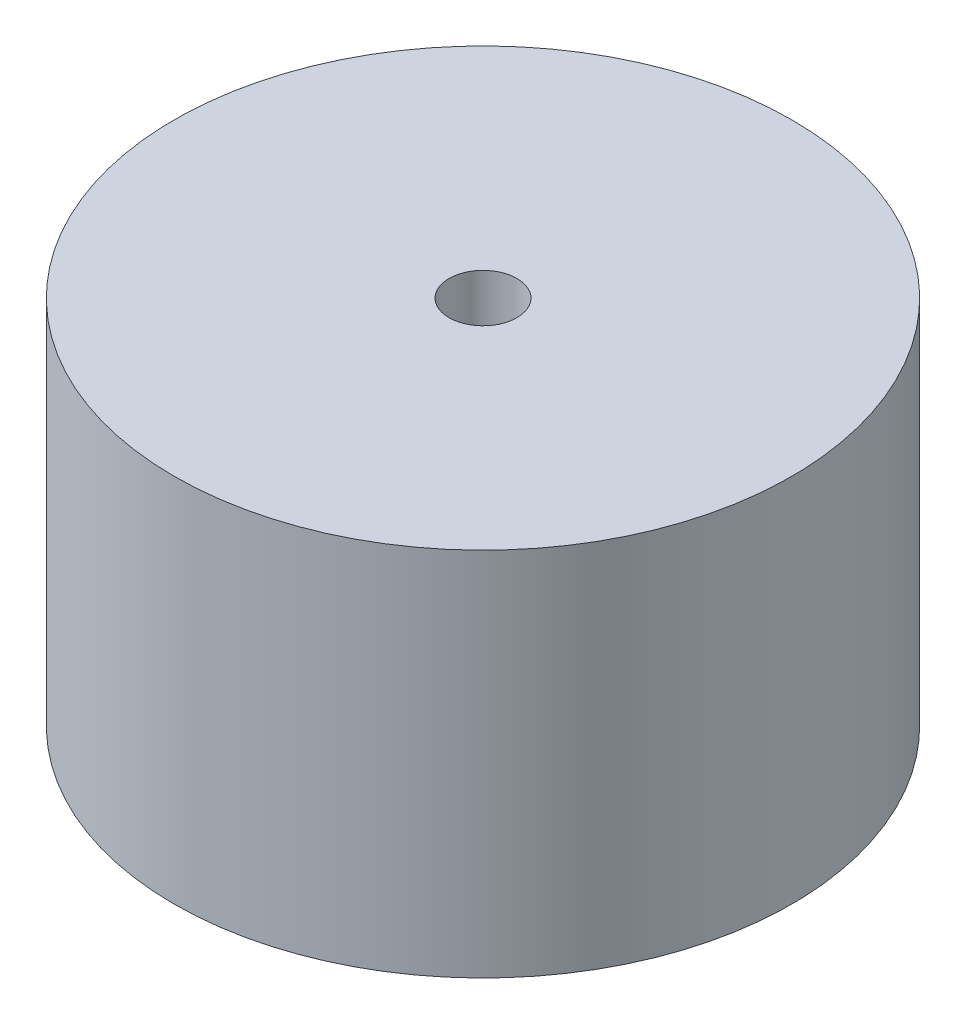
ISO-10303-21;
HEADER;
FILE_DESCRIPTION(('STEP AP214'),'2;1');
FILE_NAME('part.step','',(''),(''),'','','');
FILE_SCHEMA(('AUTOMOTIVE_DESIGN { 1 0 10303 214 1 1 1 1 }'));
ENDSEC;
DATA;
#1=APPLICATION_CONTEXT('core data for automotive mechanical design processes');
#2=APPLICATION_PROTOCOL_DEFINITION('international standard','automotive_design',2000,#1);
#3=PRODUCT_CONTEXT('',#1,'mechanical');
#4=PRODUCT('Part','Part','',(#3));
#5=PRODUCT_RELATED_PRODUCT_CATEGORY('part','',(#4));
#6=PRODUCT_DEFINITION_FORMATION('','',#4);
#7=PRODUCT_DEFINITION_CONTEXT('part definition',#1,'design');
#8=PRODUCT_DEFINITION('design','',#6,#7);
#9=PRODUCT_DEFINITION_SHAPE('','',#8);
#10=(LENGTH_UNIT() NAMED_UNIT(*) SI_UNIT(.MILLI.,.METRE.));
#11=(NAMED_UNIT(*) PLANE_ANGLE_UNIT() SI_UNIT($,.RADIAN.));
#12=(NAMED_UNIT(*) SI_UNIT($,.STERADIAN.) SOLID_ANGLE_UNIT());
#13=UNCERTAINTY_MEASURE_WITH_UNIT(LENGTH_MEASURE(1.E-05),#10,'distance_accuracy_value','');
#14=(GEOMETRIC_REPRESENTATION_CONTEXT(3) GLOBAL_UNCERTAINTY_ASSIGNED_CONTEXT((#13)) GLOBAL_UNIT_ASSIGNED_CONTEXT((#10,
#11,#12)) REPRESENTATION_CONTEXT('',''));
#15=CARTESIAN_POINT('',(0.,0.,0.));
#16=DIRECTION('',(0.,0.,1.));
#17=DIRECTION('',(1.,0.,0.));
#18=AXIS2_PLACEMENT_3D('',#15,#16,#17);
#19=CARTESIAN_POINT('',(0.,60.,0.));
#20=DIRECTION('',(0.,1.,0.));
#21=DIRECTION('',(0.,0.,1.));
#22=AXIS2_PLACEMENT_3D('',#19,#20,#21);
#23=PLANE('',#22);
#24=CARTESIAN_POINT('',(0.,60.,0.));
#25=DIRECTION('',(0.,1.,0.));
#26=DIRECTION('',(0.,0.,1.));
#27=AXIS2_PLACEMENT_3D('',#24,#25,#26);
#28=CIRCLE('',#27,50.);
#29=CARTESIAN_POINT('',(0.,60.,50.));
#30=VERTEX_POINT('',#29);
#31=EDGE_CURVE('E10',#30,#30,#28,.T.);
#32=ORIENTED_EDGE('',*,*,#31,.T.);
#33=EDGE_LOOP('',(#32));
#34=FACE_BOUND('',#33,.T.);
#35=CARTESIAN_POINT('',(0.,60.,0.));
#36=DIRECTION('',(0.,1.,0.));
#37=DIRECTION('',(0.,0.,1.));
#38=AXIS2_PLACEMENT_3D('',#35,#36,#37);
#39=CIRCLE('',#38,5.5);
#40=CARTESIAN_POINT('',(0.,60.,5.5));
#41=VERTEX_POINT('',#40);
#42=EDGE_CURVE('E56',#41,#41,#39,.T.);
#43=ORIENTED_EDGE('',*,*,#42,.F.);
#44=EDGE_LOOP('',(#43));
#45=FACE_BOUND('',#44,.T.);
#46=ADVANCED_FACE('F43',(#34,#45),#23,.T.);
#47=CARTESIAN_POINT('',(0.,0.,0.));
#48=DIRECTION('',(0.,1.,0.));
#49=DIRECTION('',(0.,0.,1.));
#50=AXIS2_PLACEMENT_3D('',#47,#48,#49);
#51=PLANE('',#50);
#52=CARTESIAN_POINT('',(0.,0.,0.));
#53=DIRECTION('',(0.,1.,0.));
#54=DIRECTION('',(0.,0.,1.));
#55=AXIS2_PLACEMENT_3D('',#52,#53,#54);
#56=CIRCLE('',#55,50.);
#57=CARTESIAN_POINT('',(0.,0.,50.));
#58=VERTEX_POINT('',#57);
#59=EDGE_CURVE('E47',#58,#58,#56,.T.);
#60=ORIENTED_EDGE('',*,*,#59,.F.);
#61=EDGE_LOOP('',(#60));
#62=FACE_BOUND('',#61,.T.);
#63=CARTESIAN_POINT('',(0.,0.,0.));
#64=DIRECTION('',(0.,1.,0.));
#65=DIRECTION('',(0.,0.,1.));
#66=AXIS2_PLACEMENT_3D('',#63,#64,#65);
#67=CIRCLE('',#66,5.5);
#68=CARTESIAN_POINT('',(0.,0.,5.5));
#69=VERTEX_POINT('',#68);
#70=EDGE_CURVE('E58',#69,#69,#67,.T.);
#71=ORIENTED_EDGE('',*,*,#70,.T.);
#72=EDGE_LOOP('',(#71));
#73=FACE_BOUND('',#72,.T.);
#74=ADVANCED_FACE('F70',(#62,#73),#51,.F.);
#75=CARTESIAN_POINT('',(0.,60.,0.));
#76=DIRECTION('',(0.,-1.,0.));
#77=DIRECTION('',(0.,0.,-1.));
#78=AXIS2_PLACEMENT_3D('',#75,#76,#77);
#79=CYLINDRICAL_SURFACE('',#78,50.);
#80=ORIENTED_EDGE('',*,*,#31,.F.);
#81=EDGE_LOOP('',(#80));
#82=FACE_BOUND('',#81,.T.);
#83=ORIENTED_EDGE('',*,*,#59,.T.);
#84=EDGE_LOOP('',(#83));
#85=FACE_BOUND('',#84,.T.);
#86=ADVANCED_FACE('F45',(#82,#85),#79,.T.);
#87=CARTESIAN_POINT('',(0.,60.,0.));
#88=DIRECTION('',(0.,-1.,0.));
#89=DIRECTION('',(0.,0.,-1.));
#90=AXIS2_PLACEMENT_3D('',#87,#88,#89);
#91=CYLINDRICAL_SURFACE('',#90,5.5);
#92=ORIENTED_EDGE('',*,*,#42,.T.);
#93=EDGE_LOOP('',(#92));
#94=FACE_BOUND('',#93,.T.);
#95=ORIENTED_EDGE('',*,*,#70,.F.);
#96=EDGE_LOOP('',(#95));
#97=FACE_BOUND('',#96,.T.);
#98=ADVANCED_FACE('F66',(#94,#97),#91,.F.);
#99=CLOSED_SHELL('',(#46,#74,#86,#98));
#100=MANIFOLD_SOLID_BREP('B2',#99);
#101=ADVANCED_BREP_SHAPE_REPRESENTATION('',(#18,#100),#14);
#102=SHAPE_DEFINITION_REPRESENTATION(#9,#101);
ENDSEC;
END-ISO-10303-21;
